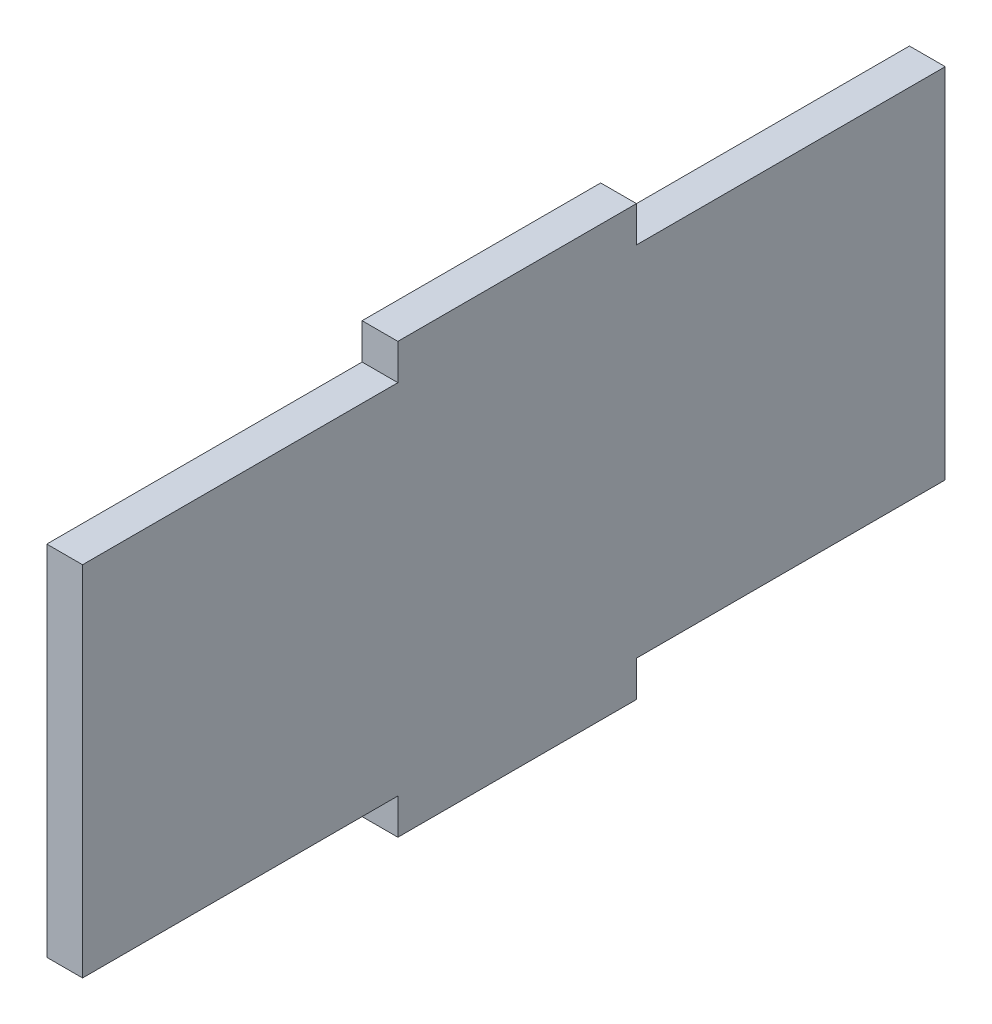
ISO-10303-21;
HEADER;
FILE_DESCRIPTION(('STEP AP214'),'2;1');
FILE_NAME('part.step','',(''),(''),'','','');
FILE_SCHEMA(('AUTOMOTIVE_DESIGN { 1 0 10303 214 1 1 1 1 }'));
ENDSEC;
DATA;
#1=APPLICATION_CONTEXT('core data for automotive mechanical design processes');
#2=APPLICATION_PROTOCOL_DEFINITION('international standard','automotive_design',2000,#1);
#3=PRODUCT_CONTEXT('',#1,'mechanical');
#4=PRODUCT('Part','Part','',(#3));
#5=PRODUCT_RELATED_PRODUCT_CATEGORY('part','',(#4));
#6=PRODUCT_DEFINITION_FORMATION('','',#4);
#7=PRODUCT_DEFINITION_CONTEXT('part definition',#1,'design');
#8=PRODUCT_DEFINITION('design','',#6,#7);
#9=PRODUCT_DEFINITION_SHAPE('','',#8);
#10=(LENGTH_UNIT() NAMED_UNIT(*) SI_UNIT(.MILLI.,.METRE.));
#11=(NAMED_UNIT(*) PLANE_ANGLE_UNIT() SI_UNIT($,.RADIAN.));
#12=(NAMED_UNIT(*) SI_UNIT($,.STERADIAN.) SOLID_ANGLE_UNIT());
#13=UNCERTAINTY_MEASURE_WITH_UNIT(LENGTH_MEASURE(1.E-05),#10,'distance_accuracy_value','');
#14=(GEOMETRIC_REPRESENTATION_CONTEXT(3) GLOBAL_UNCERTAINTY_ASSIGNED_CONTEXT((#13)) GLOBAL_UNIT_ASSIGNED_CONTEXT((#10,
#11,#12)) REPRESENTATION_CONTEXT('',''));
#15=CARTESIAN_POINT('',(0.,0.,0.));
#16=DIRECTION('',(0.,0.,1.));
#17=DIRECTION('',(1.,0.,0.));
#18=AXIS2_PLACEMENT_3D('',#15,#16,#17);
#19=CARTESIAN_POINT('',(0.,33.,0.));
#20=DIRECTION('',(0.,1.,0.));
#21=DIRECTION('',(0.,0.,1.));
#22=AXIS2_PLACEMENT_3D('',#19,#20,#21);
#23=PLANE('',#22);
#24=DIRECTION('',(1.,0.,0.));
#25=VECTOR('',#24,1.);
#26=CARTESIAN_POINT('',(-3.32073467486607,33.,54.3915852284529));
#27=LINE('',#26,#25);
#28=CARTESIAN_POINT('',(-6.32073467486607,33.,54.3915852284529));
#29=VERTEX_POINT('',#28);
#30=CARTESIAN_POINT('',(-3.32073467486607,33.,54.3915852284529));
#31=VERTEX_POINT('',#30);
#32=EDGE_CURVE('E141',#29,#31,#27,.T.);
#33=ORIENTED_EDGE('',*,*,#32,.F.);
#34=DIRECTION('',(0.,0.,1.));
#35=VECTOR('',#34,1.);
#36=CARTESIAN_POINT('',(-6.32073467486608,33.,8.51187808988101));
#37=LINE('',#36,#35);
#38=CARTESIAN_POINT('',(-6.32073467486607,33.,80.821878089881));
#39=VERTEX_POINT('',#38);
#40=EDGE_CURVE('E157',#29,#39,#37,.T.);
#41=ORIENTED_EDGE('',*,*,#40,.T.);
#42=DIRECTION('',(1.,0.,0.));
#43=VECTOR('',#42,1.);
#44=CARTESIAN_POINT('',(-6.32073467486607,33.,80.821878089881));
#45=LINE('',#44,#43);
#46=CARTESIAN_POINT('',(-3.32073467486607,33.,80.821878089881));
#47=VERTEX_POINT('',#46);
#48=EDGE_CURVE('E156',#39,#47,#45,.T.);
#49=ORIENTED_EDGE('',*,*,#48,.T.);
#50=DIRECTION('',(0.,0.,-1.));
#51=VECTOR('',#50,1.);
#52=CARTESIAN_POINT('',(-3.32073467486608,33.,8.51187808988101));
#53=LINE('',#52,#51);
#54=EDGE_CURVE('E56',#47,#31,#53,.T.);
#55=ORIENTED_EDGE('',*,*,#54,.T.);
#56=EDGE_LOOP('',(#33,#41,#49,#55));
#57=FACE_BOUND('',#56,.T.);
#58=ADVANCED_FACE('F33',(#57),#23,.T.);
#59=CARTESIAN_POINT('',(-6.32073467486608,3.,34.3915852284529));
#60=DIRECTION('',(1.,0.,0.));
#61=DIRECTION('',(0.,0.,-1.));
#62=AXIS2_PLACEMENT_3D('',#59,#60,#61);
#63=PLANE('',#62);
#64=DIRECTION('',(0.,0.,1.));
#65=VECTOR('',#64,1.);
#66=CARTESIAN_POINT('',(-6.32073467486608,0.,34.3915852284529));
#67=LINE('',#66,#65);
#68=CARTESIAN_POINT('',(-6.32073467486608,0.,34.3915852284529));
#69=VERTEX_POINT('',#68);
#70=CARTESIAN_POINT('',(-6.32073467486607,0.,54.3915852284529));
#71=VERTEX_POINT('',#70);
#72=EDGE_CURVE('E183',#69,#71,#67,.T.);
#73=ORIENTED_EDGE('',*,*,#72,.T.);
#74=DIRECTION('',(0.,-1.,0.));
#75=VECTOR('',#74,1.);
#76=CARTESIAN_POINT('',(-6.32073467486607,3.,54.3915852284529));
#77=LINE('',#76,#75);
#78=CARTESIAN_POINT('',(-6.32073467486607,3.,54.3915852284529));
#79=VERTEX_POINT('',#78);
#80=EDGE_CURVE('E11',#79,#71,#77,.T.);
#81=ORIENTED_EDGE('',*,*,#80,.F.);
#82=DIRECTION('',(0.,0.,1.));
#83=VECTOR('',#82,1.);
#84=CARTESIAN_POINT('',(-6.32073467486608,3.,8.51187808988101));
#85=LINE('',#84,#83);
#86=CARTESIAN_POINT('',(-6.32073467486607,3.,80.821878089881));
#87=VERTEX_POINT('',#86);
#88=EDGE_CURVE('E146',#79,#87,#85,.T.);
#89=ORIENTED_EDGE('',*,*,#88,.T.);
#90=DIRECTION('',(0.,-1.,0.));
#91=VECTOR('',#90,1.);
#92=CARTESIAN_POINT('',(-6.32073467486607,33.,80.821878089881));
#93=LINE('',#92,#91);
#94=EDGE_CURVE('E180',#39,#87,#93,.T.);
#95=ORIENTED_EDGE('',*,*,#94,.F.);
#96=ORIENTED_EDGE('',*,*,#40,.F.);
#97=DIRECTION('',(0.,-1.,0.));
#98=VECTOR('',#97,1.);
#99=CARTESIAN_POINT('',(-6.32073467486607,36.,54.3915852284529));
#100=LINE('',#99,#98);
#101=CARTESIAN_POINT('',(-6.32073467486607,36.,54.3915852284529));
#102=VERTEX_POINT('',#101);
#103=EDGE_CURVE('E150',#102,#29,#100,.T.);
#104=ORIENTED_EDGE('',*,*,#103,.F.);
#105=DIRECTION('',(0.,0.,1.));
#106=VECTOR('',#105,1.);
#107=CARTESIAN_POINT('',(-6.32073467486607,36.,34.3915852284529));
#108=LINE('',#107,#106);
#109=CARTESIAN_POINT('',(-6.32073467486607,36.,34.3915852284529));
#110=VERTEX_POINT('',#109);
#111=EDGE_CURVE('E131',#110,#102,#108,.T.);
#112=ORIENTED_EDGE('',*,*,#111,.F.);
#113=DIRECTION('',(0.,-1.,0.));
#114=VECTOR('',#113,1.);
#115=CARTESIAN_POINT('',(-6.32073467486607,36.,34.3915852284529));
#116=LINE('',#115,#114);
#117=CARTESIAN_POINT('',(-6.32073467486607,33.,34.3915852284529));
#118=VERTEX_POINT('',#117);
#119=EDGE_CURVE('E128',#110,#118,#116,.T.);
#120=ORIENTED_EDGE('',*,*,#119,.T.);
#121=CARTESIAN_POINT('',(-6.32073467486608,33.,8.51187808988101));
#122=VERTEX_POINT('',#121);
#123=EDGE_CURVE('E154',#122,#118,#37,.T.);
#124=ORIENTED_EDGE('',*,*,#123,.F.);
#125=DIRECTION('',(0.,-1.,0.));
#126=VECTOR('',#125,1.);
#127=CARTESIAN_POINT('',(-6.32073467486608,33.,8.51187808988101));
#128=LINE('',#127,#126);
#129=CARTESIAN_POINT('',(-6.32073467486608,3.,8.51187808988101));
#130=VERTEX_POINT('',#129);
#131=EDGE_CURVE('E161',#122,#130,#128,.T.);
#132=ORIENTED_EDGE('',*,*,#131,.T.);
#133=CARTESIAN_POINT('',(-6.32073467486607,3.,34.3915852284529));
#134=VERTEX_POINT('',#133);
#135=EDGE_CURVE('E148',#130,#134,#85,.T.);
#136=ORIENTED_EDGE('',*,*,#135,.T.);
#137=DIRECTION('',(0.,-1.,0.));
#138=VECTOR('',#137,1.);
#139=CARTESIAN_POINT('',(-6.32073467486608,3.,34.3915852284529));
#140=LINE('',#139,#138);
#141=EDGE_CURVE('E191',#134,#69,#140,.T.);
#142=ORIENTED_EDGE('',*,*,#141,.T.);
#143=EDGE_LOOP('',(#73,#81,#89,#95,#96,#104,#112,#120,#124,#132,#136,#142));
#144=FACE_BOUND('',#143,.T.);
#145=ADVANCED_FACE('F35',(#144),#63,.F.);
#146=CARTESIAN_POINT('',(-6.32073467486607,3.,54.3915852284529));
#147=DIRECTION('',(0.,0.,-1.));
#148=DIRECTION('',(-1.,0.,0.));
#149=AXIS2_PLACEMENT_3D('',#146,#147,#148);
#150=PLANE('',#149);
#151=DIRECTION('',(1.,0.,0.));
#152=VECTOR('',#151,1.);
#153=CARTESIAN_POINT('',(-6.32073467486607,0.,54.3915852284529));
#154=LINE('',#153,#152);
#155=CARTESIAN_POINT('',(-3.32073467486607,0.,54.3915852284529));
#156=VERTEX_POINT('',#155);
#157=EDGE_CURVE('E194',#71,#156,#154,.T.);
#158=ORIENTED_EDGE('',*,*,#157,.T.);
#159=DIRECTION('',(0.,-1.,0.));
#160=VECTOR('',#159,1.);
#161=CARTESIAN_POINT('',(-3.32073467486607,3.,54.3915852284529));
#162=LINE('',#161,#160);
#163=CARTESIAN_POINT('',(-3.32073467486607,3.,54.3915852284529));
#164=VERTEX_POINT('',#163);
#165=EDGE_CURVE('E41',#164,#156,#162,.T.);
#166=ORIENTED_EDGE('',*,*,#165,.F.);
#167=DIRECTION('',(1.,0.,0.));
#168=VECTOR('',#167,1.);
#169=CARTESIAN_POINT('',(-6.32073467486607,3.,54.3915852284529));
#170=LINE('',#169,#168);
#171=EDGE_CURVE('E184',#79,#164,#170,.T.);
#172=ORIENTED_EDGE('',*,*,#171,.F.);
#173=ORIENTED_EDGE('',*,*,#80,.T.);
#174=EDGE_LOOP('',(#158,#166,#172,#173));
#175=FACE_BOUND('',#174,.T.);
#176=ADVANCED_FACE('F245',(#175),#150,.F.);
#177=CARTESIAN_POINT('',(-3.32073467486607,3.,34.3915852284529));
#178=DIRECTION('',(-1.,0.,0.));
#179=DIRECTION('',(0.,0.,1.));
#180=AXIS2_PLACEMENT_3D('',#177,#178,#179);
#181=PLANE('',#180);
#182=DIRECTION('',(0.,0.,-1.));
#183=VECTOR('',#182,1.);
#184=CARTESIAN_POINT('',(-3.32073467486607,0.,34.3915852284529));
#185=LINE('',#184,#183);
#186=CARTESIAN_POINT('',(-3.32073467486607,0.,34.3915852284529));
#187=VERTEX_POINT('',#186);
#188=EDGE_CURVE('E196',#156,#187,#185,.T.);
#189=ORIENTED_EDGE('',*,*,#188,.T.);
#190=DIRECTION('',(0.,-1.,0.));
#191=VECTOR('',#190,1.);
#192=CARTESIAN_POINT('',(-3.32073467486607,3.,34.3915852284529));
#193=LINE('',#192,#191);
#194=CARTESIAN_POINT('',(-3.32073467486607,3.,34.3915852284529));
#195=VERTEX_POINT('',#194);
#196=EDGE_CURVE('E201',#195,#187,#193,.T.);
#197=ORIENTED_EDGE('',*,*,#196,.F.);
#198=DIRECTION('',(0.,0.,-1.));
#199=VECTOR('',#198,1.);
#200=CARTESIAN_POINT('',(-3.32073467486608,3.,8.51187808988101));
#201=LINE('',#200,#199);
#202=CARTESIAN_POINT('',(-3.32073467486608,3.,8.51187808988101));
#203=VERTEX_POINT('',#202);
#204=EDGE_CURVE('E166',#195,#203,#201,.T.);
#205=ORIENTED_EDGE('',*,*,#204,.T.);
#206=DIRECTION('',(0.,-1.,0.));
#207=VECTOR('',#206,1.);
#208=CARTESIAN_POINT('',(-3.32073467486608,33.,8.51187808988101));
#209=LINE('',#208,#207);
#210=CARTESIAN_POINT('',(-3.32073467486608,33.,8.51187808988101));
#211=VERTEX_POINT('',#210);
#212=EDGE_CURVE('E174',#211,#203,#209,.T.);
#213=ORIENTED_EDGE('',*,*,#212,.F.);
#214=CARTESIAN_POINT('',(-3.32073467486607,33.,34.3915852284529));
#215=VERTEX_POINT('',#214);
#216=EDGE_CURVE('E145',#215,#211,#53,.T.);
#217=ORIENTED_EDGE('',*,*,#216,.F.);
#218=DIRECTION('',(0.,-1.,0.));
#219=VECTOR('',#218,1.);
#220=CARTESIAN_POINT('',(-3.32073467486607,36.,34.3915852284529));
#221=LINE('',#220,#219);
#222=CARTESIAN_POINT('',(-3.32073467486607,36.,34.3915852284529));
#223=VERTEX_POINT('',#222);
#224=EDGE_CURVE('E126',#223,#215,#221,.T.);
#225=ORIENTED_EDGE('',*,*,#224,.F.);
#226=DIRECTION('',(0.,0.,-1.));
#227=VECTOR('',#226,1.);
#228=CARTESIAN_POINT('',(-3.32073467486607,36.,34.3915852284529));
#229=LINE('',#228,#227);
#230=CARTESIAN_POINT('',(-3.32073467486607,36.,54.3915852284529));
#231=VERTEX_POINT('',#230);
#232=EDGE_CURVE('E132',#231,#223,#229,.T.);
#233=ORIENTED_EDGE('',*,*,#232,.F.);
#234=DIRECTION('',(0.,-1.,0.));
#235=VECTOR('',#234,1.);
#236=CARTESIAN_POINT('',(-3.32073467486607,36.,54.3915852284529));
#237=LINE('',#236,#235);
#238=EDGE_CURVE('E232',#231,#31,#237,.T.);
#239=ORIENTED_EDGE('',*,*,#238,.T.);
#240=ORIENTED_EDGE('',*,*,#54,.F.);
#241=DIRECTION('',(0.,-1.,0.));
#242=VECTOR('',#241,1.);
#243=CARTESIAN_POINT('',(-3.32073467486607,33.,80.821878089881));
#244=LINE('',#243,#242);
#245=CARTESIAN_POINT('',(-3.32073467486607,3.,80.821878089881));
#246=VERTEX_POINT('',#245);
#247=EDGE_CURVE('E177',#47,#246,#244,.T.);
#248=ORIENTED_EDGE('',*,*,#247,.T.);
#249=EDGE_CURVE('E167',#246,#164,#201,.T.);
#250=ORIENTED_EDGE('',*,*,#249,.T.);
#251=ORIENTED_EDGE('',*,*,#165,.T.);
#252=EDGE_LOOP('',(#189,#197,#205,#213,#217,#225,#233,#239,#240,#248,#250,#251));
#253=FACE_BOUND('',#252,.T.);
#254=ADVANCED_FACE('F143',(#253),#181,.F.);
#255=CARTESIAN_POINT('',(-6.32073467486608,3.,34.3915852284529));
#256=DIRECTION('',(0.,0.,1.));
#257=DIRECTION('',(1.,0.,0.));
#258=AXIS2_PLACEMENT_3D('',#255,#256,#257);
#259=PLANE('',#258);
#260=DIRECTION('',(-1.,0.,0.));
#261=VECTOR('',#260,1.);
#262=CARTESIAN_POINT('',(-6.32073467486608,0.,34.3915852284529));
#263=LINE('',#262,#261);
#264=EDGE_CURVE('E188',#187,#69,#263,.T.);
#265=ORIENTED_EDGE('',*,*,#264,.T.);
#266=ORIENTED_EDGE('',*,*,#141,.F.);
#267=DIRECTION('',(-1.,0.,0.));
#268=VECTOR('',#267,1.);
#269=CARTESIAN_POINT('',(-6.32073467486608,3.,34.3915852284529));
#270=LINE('',#269,#268);
#271=EDGE_CURVE('E187',#195,#134,#270,.T.);
#272=ORIENTED_EDGE('',*,*,#271,.F.);
#273=ORIENTED_EDGE('',*,*,#196,.T.);
#274=EDGE_LOOP('',(#265,#266,#272,#273));
#275=FACE_BOUND('',#274,.T.);
#276=ADVANCED_FACE('F212',(#275),#259,.F.);
#277=CARTESIAN_POINT('',(0.,0.,0.));
#278=DIRECTION('',(0.,1.,0.));
#279=DIRECTION('',(0.,0.,1.));
#280=AXIS2_PLACEMENT_3D('',#277,#278,#279);
#281=PLANE('',#280);
#282=ORIENTED_EDGE('',*,*,#72,.F.);
#283=ORIENTED_EDGE('',*,*,#264,.F.);
#284=ORIENTED_EDGE('',*,*,#188,.F.);
#285=ORIENTED_EDGE('',*,*,#157,.F.);
#286=EDGE_LOOP('',(#282,#283,#284,#285));
#287=FACE_BOUND('',#286,.T.);
#288=ADVANCED_FACE('F210',(#287),#281,.F.);
#289=CARTESIAN_POINT('',(0.,3.,0.));
#290=DIRECTION('',(0.,1.,0.));
#291=DIRECTION('',(0.,0.,1.));
#292=AXIS2_PLACEMENT_3D('',#289,#290,#291);
#293=PLANE('',#292);
#294=ORIENTED_EDGE('',*,*,#88,.F.);
#295=ORIENTED_EDGE('',*,*,#171,.T.);
#296=ORIENTED_EDGE('',*,*,#249,.F.);
#297=DIRECTION('',(1.,0.,0.));
#298=VECTOR('',#297,1.);
#299=CARTESIAN_POINT('',(-6.32073467486607,3.,80.821878089881));
#300=LINE('',#299,#298);
#301=EDGE_CURVE('E164',#87,#246,#300,.T.);
#302=ORIENTED_EDGE('',*,*,#301,.F.);
#303=EDGE_LOOP('',(#294,#295,#296,#302));
#304=FACE_BOUND('',#303,.T.);
#305=ADVANCED_FACE('F244',(#304),#293,.F.);
#306=ORIENTED_EDGE('',*,*,#204,.F.);
#307=ORIENTED_EDGE('',*,*,#271,.T.);
#308=ORIENTED_EDGE('',*,*,#135,.F.);
#309=DIRECTION('',(-1.,0.,0.));
#310=VECTOR('',#309,1.);
#311=CARTESIAN_POINT('',(-6.32073467486608,3.,8.51187808988101));
#312=LINE('',#311,#310);
#313=EDGE_CURVE('E170',#203,#130,#312,.T.);
#314=ORIENTED_EDGE('',*,*,#313,.F.);
#315=EDGE_LOOP('',(#306,#307,#308,#314));
#316=FACE_BOUND('',#315,.T.);
#317=ADVANCED_FACE('F222',(#316),#293,.F.);
#318=CARTESIAN_POINT('',(-6.32073467486607,33.,80.821878089881));
#319=DIRECTION('',(0.,0.,-1.));
#320=DIRECTION('',(-1.,0.,0.));
#321=AXIS2_PLACEMENT_3D('',#318,#319,#320);
#322=PLANE('',#321);
#323=ORIENTED_EDGE('',*,*,#301,.T.);
#324=ORIENTED_EDGE('',*,*,#247,.F.);
#325=ORIENTED_EDGE('',*,*,#48,.F.);
#326=ORIENTED_EDGE('',*,*,#94,.T.);
#327=EDGE_LOOP('',(#323,#324,#325,#326));
#328=FACE_BOUND('',#327,.T.);
#329=ADVANCED_FACE('F247',(#328),#322,.F.);
#330=CARTESIAN_POINT('',(-6.32073467486608,33.,8.51187808988101));
#331=DIRECTION('',(0.,0.,1.));
#332=DIRECTION('',(1.,0.,0.));
#333=AXIS2_PLACEMENT_3D('',#330,#331,#332);
#334=PLANE('',#333);
#335=ORIENTED_EDGE('',*,*,#313,.T.);
#336=ORIENTED_EDGE('',*,*,#131,.F.);
#337=DIRECTION('',(-1.,0.,0.));
#338=VECTOR('',#337,1.);
#339=CARTESIAN_POINT('',(-6.32073467486608,33.,8.51187808988101));
#340=LINE('',#339,#338);
#341=EDGE_CURVE('E160',#211,#122,#340,.T.);
#342=ORIENTED_EDGE('',*,*,#341,.F.);
#343=ORIENTED_EDGE('',*,*,#212,.T.);
#344=EDGE_LOOP('',(#335,#336,#342,#343));
#345=FACE_BOUND('',#344,.T.);
#346=ADVANCED_FACE('F225',(#345),#334,.F.);
#347=DIRECTION('',(-1.,0.,0.));
#348=VECTOR('',#347,1.);
#349=CARTESIAN_POINT('',(-3.32073467486607,33.,34.3915852284529));
#350=LINE('',#349,#348);
#351=EDGE_CURVE('E48',#215,#118,#350,.T.);
#352=ORIENTED_EDGE('',*,*,#351,.F.);
#353=ORIENTED_EDGE('',*,*,#216,.T.);
#354=ORIENTED_EDGE('',*,*,#341,.T.);
#355=ORIENTED_EDGE('',*,*,#123,.T.);
#356=EDGE_LOOP('',(#352,#353,#354,#355));
#357=FACE_BOUND('',#356,.T.);
#358=ADVANCED_FACE('F226',(#357),#23,.T.);
#359=CARTESIAN_POINT('',(-3.32073467486607,36.,34.3915852284529));
#360=DIRECTION('',(0.,0.,1.));
#361=DIRECTION('',(1.,0.,0.));
#362=AXIS2_PLACEMENT_3D('',#359,#360,#361);
#363=PLANE('',#362);
#364=ORIENTED_EDGE('',*,*,#351,.T.);
#365=ORIENTED_EDGE('',*,*,#119,.F.);
#366=DIRECTION('',(-1.,0.,0.));
#367=VECTOR('',#366,1.);
#368=CARTESIAN_POINT('',(-3.32073467486607,36.,34.3915852284529));
#369=LINE('',#368,#367);
#370=EDGE_CURVE('E122',#223,#110,#369,.T.);
#371=ORIENTED_EDGE('',*,*,#370,.F.);
#372=ORIENTED_EDGE('',*,*,#224,.T.);
#373=EDGE_LOOP('',(#364,#365,#371,#372));
#374=FACE_BOUND('',#373,.T.);
#375=ADVANCED_FACE('F124',(#374),#363,.F.);
#376=CARTESIAN_POINT('',(-3.32073467486607,36.,54.3915852284529));
#377=DIRECTION('',(0.,0.,-1.));
#378=DIRECTION('',(-1.,0.,0.));
#379=AXIS2_PLACEMENT_3D('',#376,#377,#378);
#380=PLANE('',#379);
#381=ORIENTED_EDGE('',*,*,#32,.T.);
#382=ORIENTED_EDGE('',*,*,#238,.F.);
#383=DIRECTION('',(1.,0.,0.));
#384=VECTOR('',#383,1.);
#385=CARTESIAN_POINT('',(-3.32073467486607,36.,54.3915852284529));
#386=LINE('',#385,#384);
#387=EDGE_CURVE('E137',#102,#231,#386,.T.);
#388=ORIENTED_EDGE('',*,*,#387,.F.);
#389=ORIENTED_EDGE('',*,*,#103,.T.);
#390=EDGE_LOOP('',(#381,#382,#388,#389));
#391=FACE_BOUND('',#390,.T.);
#392=ADVANCED_FACE('F237',(#391),#380,.F.);
#393=CARTESIAN_POINT('',(0.,36.,0.));
#394=DIRECTION('',(0.,-1.,0.));
#395=DIRECTION('',(0.,0.,-1.));
#396=AXIS2_PLACEMENT_3D('',#393,#394,#395);
#397=PLANE('',#396);
#398=ORIENTED_EDGE('',*,*,#232,.T.);
#399=ORIENTED_EDGE('',*,*,#370,.T.);
#400=ORIENTED_EDGE('',*,*,#111,.T.);
#401=ORIENTED_EDGE('',*,*,#387,.T.);
#402=EDGE_LOOP('',(#398,#399,#400,#401));
#403=FACE_BOUND('',#402,.T.);
#404=ADVANCED_FACE('F135',(#403),#397,.F.);
#405=CLOSED_SHELL('',(#58,#145,#176,#254,#276,#288,#305,#317,#329,#346,#358,#375,#392,#404));
#406=MANIFOLD_SOLID_BREP('B2',#405);
#407=ADVANCED_BREP_SHAPE_REPRESENTATION('',(#18,#406),#14);
#408=SHAPE_DEFINITION_REPRESENTATION(#9,#407);
ENDSEC;
END-ISO-10303-21;
